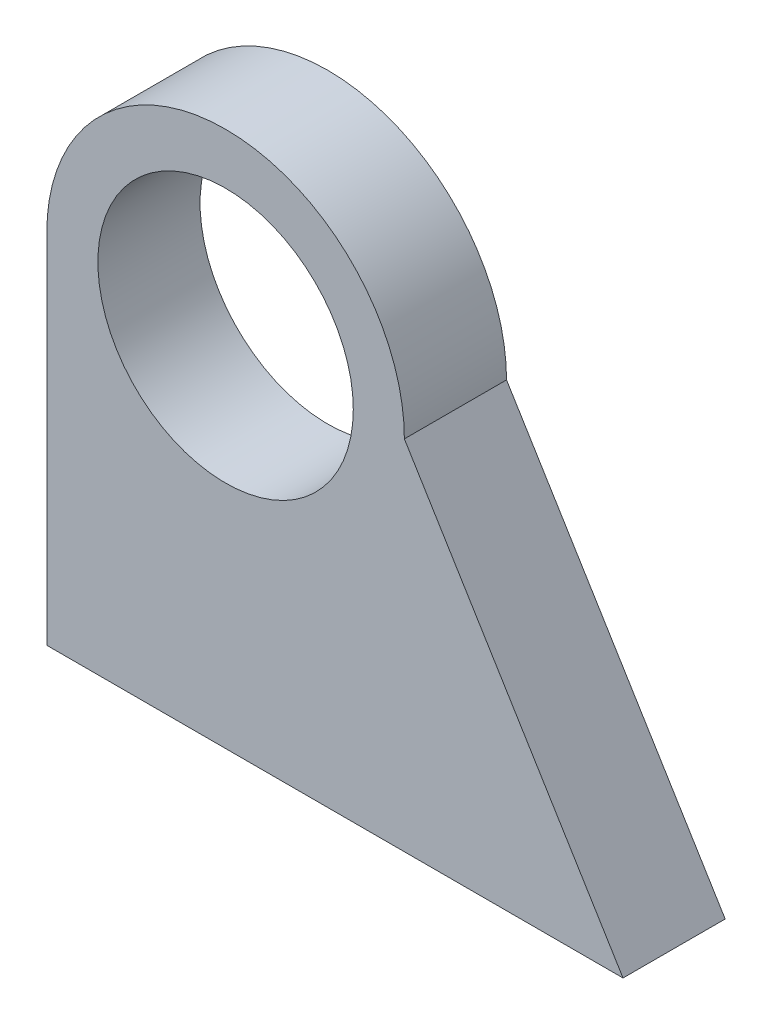
ISO-10303-21;
HEADER;
FILE_DESCRIPTION(('STEP AP214'),'2;1');
FILE_NAME('part.step','',(''),(''),'','','');
FILE_SCHEMA(('AUTOMOTIVE_DESIGN { 1 0 10303 214 1 1 1 1 }'));
ENDSEC;
DATA;
#1=APPLICATION_CONTEXT('core data for automotive mechanical design processes');
#2=APPLICATION_PROTOCOL_DEFINITION('international standard','automotive_design',2000,#1);
#3=PRODUCT_CONTEXT('',#1,'mechanical');
#4=PRODUCT('Part','Part','',(#3));
#5=PRODUCT_RELATED_PRODUCT_CATEGORY('part','',(#4));
#6=PRODUCT_DEFINITION_FORMATION('','',#4);
#7=PRODUCT_DEFINITION_CONTEXT('part definition',#1,'design');
#8=PRODUCT_DEFINITION('design','',#6,#7);
#9=PRODUCT_DEFINITION_SHAPE('','',#8);
#10=(LENGTH_UNIT() NAMED_UNIT(*) SI_UNIT(.MILLI.,.METRE.));
#11=(NAMED_UNIT(*) PLANE_ANGLE_UNIT() SI_UNIT($,.RADIAN.));
#12=(NAMED_UNIT(*) SI_UNIT($,.STERADIAN.) SOLID_ANGLE_UNIT());
#13=UNCERTAINTY_MEASURE_WITH_UNIT(LENGTH_MEASURE(1.E-05),#10,'distance_accuracy_value','');
#14=(GEOMETRIC_REPRESENTATION_CONTEXT(3) GLOBAL_UNCERTAINTY_ASSIGNED_CONTEXT((#13)) GLOBAL_UNIT_ASSIGNED_CONTEXT((#10,
#11,#12)) REPRESENTATION_CONTEXT('',''));
#15=CARTESIAN_POINT('',(0.,0.,0.));
#16=DIRECTION('',(0.,0.,1.));
#17=DIRECTION('',(1.,0.,0.));
#18=AXIS2_PLACEMENT_3D('',#15,#16,#17);
#19=CARTESIAN_POINT('',(17.5,35.,10.));
#20=DIRECTION('',(0.,0.,-1.));
#21=DIRECTION('',(-1.,0.,0.));
#22=AXIS2_PLACEMENT_3D('',#19,#20,#21);
#23=PLANE('',#22);
#24=CARTESIAN_POINT('',(17.5,35.,10.));
#25=DIRECTION('',(0.,0.,1.));
#26=DIRECTION('',(-1.,0.,0.));
#27=AXIS2_PLACEMENT_3D('',#24,#25,#26);
#28=CIRCLE('',#27,17.5);
#29=CARTESIAN_POINT('',(35.,35.,10.));
#30=VERTEX_POINT('',#29);
#31=CARTESIAN_POINT('',(0.,35.,10.));
#32=VERTEX_POINT('',#31);
#33=EDGE_CURVE('E96',#30,#32,#28,.T.);
#34=ORIENTED_EDGE('',*,*,#33,.T.);
#35=DIRECTION('',(0.,-1.,0.));
#36=VECTOR('',#35,1.);
#37=CARTESIAN_POINT('',(0.,35.,10.));
#38=LINE('',#37,#36);
#39=CARTESIAN_POINT('',(0.,0.,10.));
#40=VERTEX_POINT('',#39);
#41=EDGE_CURVE('E91',#32,#40,#38,.T.);
#42=ORIENTED_EDGE('',*,*,#41,.T.);
#43=DIRECTION('',(1.,0.,0.));
#44=VECTOR('',#43,1.);
#45=CARTESIAN_POINT('',(0.,0.,10.));
#46=LINE('',#45,#44);
#47=CARTESIAN_POINT('',(56.4024390243903,0.,10.));
#48=VERTEX_POINT('',#47);
#49=EDGE_CURVE('E94',#40,#48,#46,.T.);
#50=ORIENTED_EDGE('',*,*,#49,.T.);
#51=DIRECTION('',(-0.521690468361855,0.853134839999158,0.));
#52=VECTOR('',#51,1.);
#53=CARTESIAN_POINT('',(56.4024390243903,0.,10.));
#54=LINE('',#53,#52);
#55=EDGE_CURVE('E61',#48,#30,#54,.T.);
#56=ORIENTED_EDGE('',*,*,#55,.T.);
#57=EDGE_LOOP('',(#34,#42,#50,#56));
#58=FACE_BOUND('',#57,.T.);
#59=CARTESIAN_POINT('',(17.5,35.,10.));
#60=DIRECTION('',(0.,0.,1.));
#61=DIRECTION('',(1.,0.,0.));
#62=AXIS2_PLACEMENT_3D('',#59,#60,#61);
#63=CIRCLE('',#62,12.5);
#64=CARTESIAN_POINT('',(30.,35.,10.));
#65=VERTEX_POINT('',#64);
#66=EDGE_CURVE('E116',#65,#65,#63,.T.);
#67=ORIENTED_EDGE('',*,*,#66,.F.);
#68=EDGE_LOOP('',(#67));
#69=FACE_BOUND('',#68,.T.);
#70=ADVANCED_FACE('F43',(#58,#69),#23,.F.);
#71=CARTESIAN_POINT('',(17.5,35.,0.));
#72=DIRECTION('',(0.,0.,-1.));
#73=DIRECTION('',(-1.,0.,0.));
#74=AXIS2_PLACEMENT_3D('',#71,#72,#73);
#75=PLANE('',#74);
#76=CARTESIAN_POINT('',(17.5,35.,0.));
#77=DIRECTION('',(0.,0.,1.));
#78=DIRECTION('',(-1.,0.,0.));
#79=AXIS2_PLACEMENT_3D('',#76,#77,#78);
#80=CIRCLE('',#79,17.5);
#81=CARTESIAN_POINT('',(35.,35.,0.));
#82=VERTEX_POINT('',#81);
#83=CARTESIAN_POINT('',(0.,35.,0.));
#84=VERTEX_POINT('',#83);
#85=EDGE_CURVE('E112',#82,#84,#80,.T.);
#86=ORIENTED_EDGE('',*,*,#85,.F.);
#87=DIRECTION('',(-0.521690468361855,0.853134839999158,0.));
#88=VECTOR('',#87,1.);
#89=CARTESIAN_POINT('',(56.4024390243903,0.,0.));
#90=LINE('',#89,#88);
#91=CARTESIAN_POINT('',(56.4024390243903,0.,0.));
#92=VERTEX_POINT('',#91);
#93=EDGE_CURVE('E84',#92,#82,#90,.T.);
#94=ORIENTED_EDGE('',*,*,#93,.F.);
#95=DIRECTION('',(1.,0.,0.));
#96=VECTOR('',#95,1.);
#97=CARTESIAN_POINT('',(0.,0.,0.));
#98=LINE('',#97,#96);
#99=CARTESIAN_POINT('',(0.,0.,0.));
#100=VERTEX_POINT('',#99);
#101=EDGE_CURVE('E78',#100,#92,#98,.T.);
#102=ORIENTED_EDGE('',*,*,#101,.F.);
#103=DIRECTION('',(0.,-1.,0.));
#104=VECTOR('',#103,1.);
#105=CARTESIAN_POINT('',(0.,35.,0.));
#106=LINE('',#105,#104);
#107=EDGE_CURVE('E101',#84,#100,#106,.T.);
#108=ORIENTED_EDGE('',*,*,#107,.F.);
#109=EDGE_LOOP('',(#86,#94,#102,#108));
#110=FACE_BOUND('',#109,.T.);
#111=CARTESIAN_POINT('',(17.5,35.,0.));
#112=DIRECTION('',(0.,0.,1.));
#113=DIRECTION('',(1.,0.,0.));
#114=AXIS2_PLACEMENT_3D('',#111,#112,#113);
#115=CIRCLE('',#114,12.5);
#116=CARTESIAN_POINT('',(30.,35.,0.));
#117=VERTEX_POINT('',#116);
#118=EDGE_CURVE('E134',#117,#117,#115,.T.);
#119=ORIENTED_EDGE('',*,*,#118,.T.);
#120=EDGE_LOOP('',(#119));
#121=FACE_BOUND('',#120,.T.);
#122=ADVANCED_FACE('F129',(#110,#121),#75,.T.);
#123=CARTESIAN_POINT('',(17.5,35.,10.));
#124=DIRECTION('',(0.,0.,-1.));
#125=DIRECTION('',(-1.,0.,0.));
#126=AXIS2_PLACEMENT_3D('',#123,#124,#125);
#127=CYLINDRICAL_SURFACE('',#126,17.5);
#128=ORIENTED_EDGE('',*,*,#85,.T.);
#129=DIRECTION('',(0.,0.,-1.));
#130=VECTOR('',#129,1.);
#131=CARTESIAN_POINT('',(0.,35.,10.));
#132=LINE('',#131,#130);
#133=EDGE_CURVE('E11',#32,#84,#132,.T.);
#134=ORIENTED_EDGE('',*,*,#133,.F.);
#135=ORIENTED_EDGE('',*,*,#33,.F.);
#136=DIRECTION('',(0.,0.,-1.));
#137=VECTOR('',#136,1.);
#138=CARTESIAN_POINT('',(35.,35.,10.));
#139=LINE('',#138,#137);
#140=EDGE_CURVE('E108',#30,#82,#139,.T.);
#141=ORIENTED_EDGE('',*,*,#140,.T.);
#142=EDGE_LOOP('',(#128,#134,#135,#141));
#143=FACE_BOUND('',#142,.T.);
#144=ADVANCED_FACE('F45',(#143),#127,.T.);
#145=CARTESIAN_POINT('',(0.,35.,10.));
#146=DIRECTION('',(1.,0.,0.));
#147=DIRECTION('',(0.,0.,-1.));
#148=AXIS2_PLACEMENT_3D('',#145,#146,#147);
#149=PLANE('',#148);
#150=ORIENTED_EDGE('',*,*,#107,.T.);
#151=DIRECTION('',(0.,0.,-1.));
#152=VECTOR('',#151,1.);
#153=CARTESIAN_POINT('',(0.,0.,10.));
#154=LINE('',#153,#152);
#155=EDGE_CURVE('E53',#40,#100,#154,.T.);
#156=ORIENTED_EDGE('',*,*,#155,.F.);
#157=ORIENTED_EDGE('',*,*,#41,.F.);
#158=ORIENTED_EDGE('',*,*,#133,.T.);
#159=EDGE_LOOP('',(#150,#156,#157,#158));
#160=FACE_BOUND('',#159,.T.);
#161=ADVANCED_FACE('F100',(#160),#149,.F.);
#162=CARTESIAN_POINT('',(0.,0.,10.));
#163=DIRECTION('',(0.,1.,0.));
#164=DIRECTION('',(0.,0.,1.));
#165=AXIS2_PLACEMENT_3D('',#162,#163,#164);
#166=PLANE('',#165);
#167=ORIENTED_EDGE('',*,*,#101,.T.);
#168=DIRECTION('',(0.,0.,-1.));
#169=VECTOR('',#168,1.);
#170=CARTESIAN_POINT('',(56.4024390243903,0.,10.));
#171=LINE('',#170,#169);
#172=EDGE_CURVE('E103',#48,#92,#171,.T.);
#173=ORIENTED_EDGE('',*,*,#172,.F.);
#174=ORIENTED_EDGE('',*,*,#49,.F.);
#175=ORIENTED_EDGE('',*,*,#155,.T.);
#176=EDGE_LOOP('',(#167,#173,#174,#175));
#177=FACE_BOUND('',#176,.T.);
#178=ADVANCED_FACE('F104',(#177),#166,.F.);
#179=CARTESIAN_POINT('',(56.4024390243903,0.,10.));
#180=DIRECTION('',(-0.853134839999158,-0.521690468361855,0.));
#181=DIRECTION('',(0.521690468361855,-0.853134839999158,0.));
#182=AXIS2_PLACEMENT_3D('',#179,#180,#181);
#183=PLANE('',#182);
#184=ORIENTED_EDGE('',*,*,#93,.T.);
#185=ORIENTED_EDGE('',*,*,#140,.F.);
#186=ORIENTED_EDGE('',*,*,#55,.F.);
#187=ORIENTED_EDGE('',*,*,#172,.T.);
#188=EDGE_LOOP('',(#184,#185,#186,#187));
#189=FACE_BOUND('',#188,.T.);
#190=ADVANCED_FACE('F126',(#189),#183,.F.);
#191=CARTESIAN_POINT('',(17.5,35.,10.));
#192=DIRECTION('',(0.,0.,-1.));
#193=DIRECTION('',(-1.,0.,0.));
#194=AXIS2_PLACEMENT_3D('',#191,#192,#193);
#195=CYLINDRICAL_SURFACE('',#194,12.5);
#196=ORIENTED_EDGE('',*,*,#66,.T.);
#197=EDGE_LOOP('',(#196));
#198=FACE_BOUND('',#197,.T.);
#199=ORIENTED_EDGE('',*,*,#118,.F.);
#200=EDGE_LOOP('',(#199));
#201=FACE_BOUND('',#200,.T.);
#202=ADVANCED_FACE('F142',(#198,#201),#195,.F.);
#203=CLOSED_SHELL('',(#70,#122,#144,#161,#178,#190,#202));
#204=MANIFOLD_SOLID_BREP('B2',#203);
#205=ADVANCED_BREP_SHAPE_REPRESENTATION('',(#18,#204),#14);
#206=SHAPE_DEFINITION_REPRESENTATION(#9,#205);
ENDSEC;
END-ISO-10303-21;
